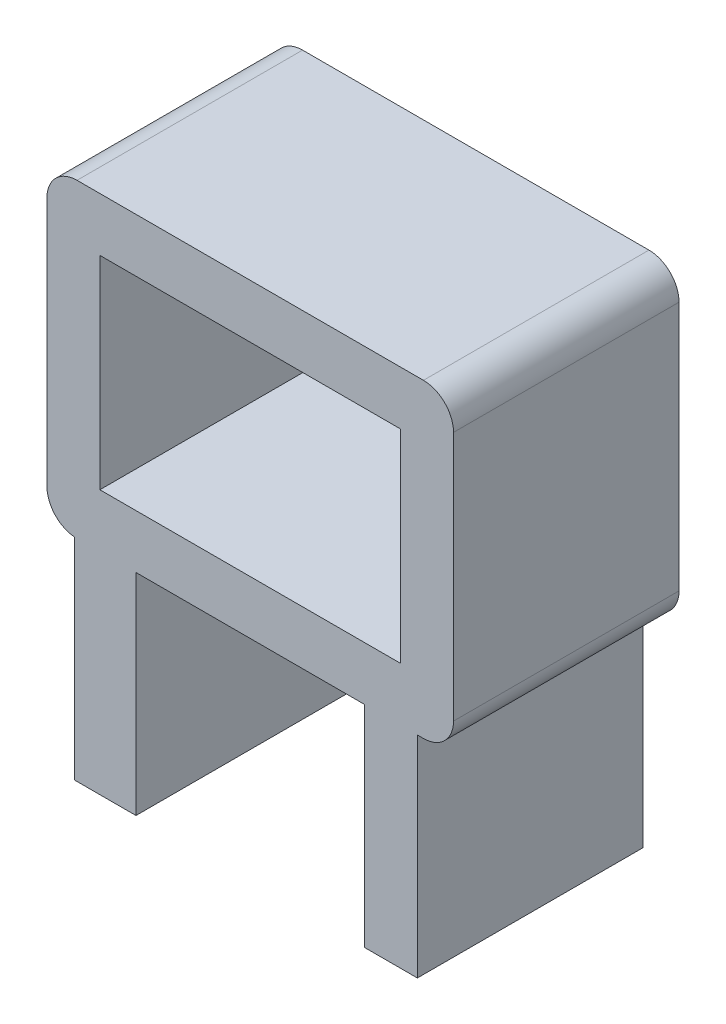
ISO-10303-21;
HEADER;
FILE_DESCRIPTION(('STEP AP214'),'2;1');
FILE_NAME('part.step','',(''),(''),'','','');
FILE_SCHEMA(('AUTOMOTIVE_DESIGN { 1 0 10303 214 1 1 1 1 }'));
ENDSEC;
DATA;
#1=APPLICATION_CONTEXT('core data for automotive mechanical design processes');
#2=APPLICATION_PROTOCOL_DEFINITION('international standard','automotive_design',2000,#1);
#3=PRODUCT_CONTEXT('',#1,'mechanical');
#4=PRODUCT('Part','Part','',(#3));
#5=PRODUCT_RELATED_PRODUCT_CATEGORY('part','',(#4));
#6=PRODUCT_DEFINITION_FORMATION('','',#4);
#7=PRODUCT_DEFINITION_CONTEXT('part definition',#1,'design');
#8=PRODUCT_DEFINITION('design','',#6,#7);
#9=PRODUCT_DEFINITION_SHAPE('','',#8);
#10=(LENGTH_UNIT() NAMED_UNIT(*) SI_UNIT(.MILLI.,.METRE.));
#11=(NAMED_UNIT(*) PLANE_ANGLE_UNIT() SI_UNIT($,.RADIAN.));
#12=(NAMED_UNIT(*) SI_UNIT($,.STERADIAN.) SOLID_ANGLE_UNIT());
#13=UNCERTAINTY_MEASURE_WITH_UNIT(LENGTH_MEASURE(1.E-05),#10,'distance_accuracy_value','');
#14=(GEOMETRIC_REPRESENTATION_CONTEXT(3) GLOBAL_UNCERTAINTY_ASSIGNED_CONTEXT((#13)) GLOBAL_UNIT_ASSIGNED_CONTEXT((#10,
#11,#12)) REPRESENTATION_CONTEXT('',''));
#15=CARTESIAN_POINT('',(0.,0.,0.));
#16=DIRECTION('',(0.,0.,1.));
#17=DIRECTION('',(1.,0.,0.));
#18=AXIS2_PLACEMENT_3D('',#15,#16,#17);
#19=CARTESIAN_POINT('',(0.,0.,15.));
#20=DIRECTION('',(0.,0.,-1.));
#21=DIRECTION('',(-1.,0.,0.));
#22=AXIS2_PLACEMENT_3D('',#19,#20,#21);
#23=PLANE('',#22);
#24=DIRECTION('',(0.,-1.,0.));
#25=VECTOR('',#24,1.);
#26=CARTESIAN_POINT('',(-25.8251099907621,19.935146108673,15.));
#27=LINE('',#26,#25);
#28=CARTESIAN_POINT('',(-25.8251099907621,17.935146108673,15.));
#29=VERTEX_POINT('',#28);
#30=CARTESIAN_POINT('',(-25.8251099907621,1.29754795464989,15.));
#31=VERTEX_POINT('',#30);
#32=EDGE_CURVE('E214',#29,#31,#27,.T.);
#33=ORIENTED_EDGE('',*,*,#32,.T.);
#34=CARTESIAN_POINT('',(-23.8251099907621,1.2975479546499,15.));
#35=DIRECTION('',(0.,0.,-1.));
#36=DIRECTION('',(-1.,0.,0.));
#37=AXIS2_PLACEMENT_3D('',#34,#35,#36);
#38=CIRCLE('',#37,2.);
#39=CARTESIAN_POINT('',(-24.0068353676499,-0.694178905990135,15.));
#40=VERTEX_POINT('',#39);
#41=EDGE_CURVE('E297',#31,#40,#38,.F.);
#42=ORIENTED_EDGE('',*,*,#41,.T.);
#43=DIRECTION('',(0.,-1.,0.));
#44=VECTOR('',#43,1.);
#45=CARTESIAN_POINT('',(-24.0068353676499,-14.6941789059901,15.));
#46=LINE('',#45,#44);
#47=CARTESIAN_POINT('',(-24.0068353676499,-14.6941789059901,15.));
#48=VERTEX_POINT('',#47);
#49=EDGE_CURVE('E217',#40,#48,#46,.T.);
#50=ORIENTED_EDGE('',*,*,#49,.T.);
#51=DIRECTION('',(1.,0.,0.));
#52=VECTOR('',#51,1.);
#53=CARTESIAN_POINT('',(-19.9047171963891,-14.6941789059901,15.));
#54=LINE('',#53,#52);
#55=CARTESIAN_POINT('',(-19.9047171963891,-14.6941789059901,15.));
#56=VERTEX_POINT('',#55);
#57=EDGE_CURVE('E219',#48,#56,#54,.T.);
#58=ORIENTED_EDGE('',*,*,#57,.T.);
#59=DIRECTION('',(0.,1.,0.));
#60=VECTOR('',#59,1.);
#61=CARTESIAN_POINT('',(-19.9047171963891,-0.694178905990134,15.));
#62=LINE('',#61,#60);
#63=CARTESIAN_POINT('',(-19.9047171963891,-0.694178905990134,15.));
#64=VERTEX_POINT('',#63);
#65=EDGE_CURVE('E221',#56,#64,#62,.T.);
#66=ORIENTED_EDGE('',*,*,#65,.T.);
#67=DIRECTION('',(1.,0.,0.));
#68=VECTOR('',#67,1.);
#69=CARTESIAN_POINT('',(-19.9047171963891,-0.694178905990134,15.));
#70=LINE('',#69,#68);
#71=CARTESIAN_POINT('',(-4.70471719638909,-0.694178905990131,15.));
#72=VERTEX_POINT('',#71);
#73=EDGE_CURVE('E223',#64,#72,#70,.T.);
#74=ORIENTED_EDGE('',*,*,#73,.T.);
#75=DIRECTION('',(0.,-1.,0.));
#76=VECTOR('',#75,1.);
#77=CARTESIAN_POINT('',(-4.70471719638909,-0.694178905990131,15.));
#78=LINE('',#77,#76);
#79=CARTESIAN_POINT('',(-4.70471719638909,-14.6941789059901,15.));
#80=VERTEX_POINT('',#79);
#81=EDGE_CURVE('E225',#72,#80,#78,.T.);
#82=ORIENTED_EDGE('',*,*,#81,.T.);
#83=DIRECTION('',(1.,0.,0.));
#84=VECTOR('',#83,1.);
#85=CARTESIAN_POINT('',(-4.70471719638909,-14.6941789059901,15.));
#86=LINE('',#85,#84);
#87=CARTESIAN_POINT('',(-1.18813915846709,-14.6941789059901,15.));
#88=VERTEX_POINT('',#87);
#89=EDGE_CURVE('E227',#80,#88,#86,.T.);
#90=ORIENTED_EDGE('',*,*,#89,.T.);
#91=DIRECTION('',(0.,1.,0.));
#92=VECTOR('',#91,1.);
#93=CARTESIAN_POINT('',(-1.18813915846709,-14.6941789059901,15.));
#94=LINE('',#93,#92);
#95=CARTESIAN_POINT('',(-1.18813915846709,-0.694178905990132,15.));
#96=VERTEX_POINT('',#95);
#97=EDGE_CURVE('E229',#88,#96,#94,.T.);
#98=ORIENTED_EDGE('',*,*,#97,.T.);
#99=DIRECTION('',(1.,0.,0.));
#100=VECTOR('',#99,1.);
#101=CARTESIAN_POINT('',(-1.18813915846709,-0.694178905990132,15.));
#102=LINE('',#101,#100);
#103=CARTESIAN_POINT('',(-0.784324402016098,-0.694178905990132,15.));
#104=VERTEX_POINT('',#103);
#105=EDGE_CURVE('E206',#96,#104,#102,.T.);
#106=ORIENTED_EDGE('',*,*,#105,.T.);
#107=CARTESIAN_POINT('',(-0.784324402016099,1.30582109400987,15.));
#108=DIRECTION('',(0.,0.,-1.));
#109=DIRECTION('',(-1.,0.,0.));
#110=AXIS2_PLACEMENT_3D('',#107,#108,#109);
#111=CIRCLE('',#110,2.);
#112=CARTESIAN_POINT('',(1.2156755979839,1.30582109400987,15.));
#113=VERTEX_POINT('',#112);
#114=EDGE_CURVE('E295',#104,#113,#111,.F.);
#115=ORIENTED_EDGE('',*,*,#114,.T.);
#116=DIRECTION('',(0.,1.,0.));
#117=VECTOR('',#116,1.);
#118=CARTESIAN_POINT('',(1.2156755979839,19.935146108673,15.));
#119=LINE('',#118,#117);
#120=CARTESIAN_POINT('',(1.2156755979839,17.935146108673,15.));
#121=VERTEX_POINT('',#120);
#122=EDGE_CURVE('E209',#113,#121,#119,.T.);
#123=ORIENTED_EDGE('',*,*,#122,.T.);
#124=CARTESIAN_POINT('',(-0.7843244020161,17.935146108673,15.));
#125=DIRECTION('',(0.,0.,-1.));
#126=DIRECTION('',(-1.,0.,0.));
#127=AXIS2_PLACEMENT_3D('',#124,#125,#126);
#128=CIRCLE('',#127,2.);
#129=CARTESIAN_POINT('',(-0.7843244020161,19.935146108673,15.));
#130=VERTEX_POINT('',#129);
#131=EDGE_CURVE('E53',#121,#130,#128,.F.);
#132=ORIENTED_EDGE('',*,*,#131,.T.);
#133=DIRECTION('',(-1.,0.,0.));
#134=VECTOR('',#133,1.);
#135=CARTESIAN_POINT('',(-25.8251099907621,19.935146108673,15.));
#136=LINE('',#135,#134);
#137=CARTESIAN_POINT('',(-23.8251099907621,19.935146108673,15.));
#138=VERTEX_POINT('',#137);
#139=EDGE_CURVE('E212',#130,#138,#136,.T.);
#140=ORIENTED_EDGE('',*,*,#139,.T.);
#141=CARTESIAN_POINT('',(-23.8251099907621,17.935146108673,15.));
#142=DIRECTION('',(0.,0.,-1.));
#143=DIRECTION('',(-1.,0.,0.));
#144=AXIS2_PLACEMENT_3D('',#141,#142,#143);
#145=CIRCLE('',#144,2.);
#146=EDGE_CURVE('E293',#138,#29,#145,.F.);
#147=ORIENTED_EDGE('',*,*,#146,.T.);
#148=EDGE_LOOP('',(#33,#42,#50,#58,#66,#74,#82,#90,#98,#106,#115,#123,#132,#140,#147));
#149=FACE_BOUND('',#148,.T.);
#150=DIRECTION('',(0.,1.,0.));
#151=VECTOR('',#150,1.);
#152=CARTESIAN_POINT('',(-2.30471719638909,16.3704836013414,15.));
#153=LINE('',#152,#151);
#154=CARTESIAN_POINT('',(-2.30471719638909,2.87048360134142,15.));
#155=VERTEX_POINT('',#154);
#156=CARTESIAN_POINT('',(-2.30471719638909,16.3704836013414,15.));
#157=VERTEX_POINT('',#156);
#158=EDGE_CURVE('E165',#155,#157,#153,.T.);
#159=ORIENTED_EDGE('',*,*,#158,.F.);
#160=DIRECTION('',(1.,0.,0.));
#161=VECTOR('',#160,1.);
#162=CARTESIAN_POINT('',(-22.3047171963891,2.87048360134142,15.));
#163=LINE('',#162,#161);
#164=CARTESIAN_POINT('',(-22.3047171963891,2.87048360134142,15.));
#165=VERTEX_POINT('',#164);
#166=EDGE_CURVE('E190',#165,#155,#163,.T.);
#167=ORIENTED_EDGE('',*,*,#166,.F.);
#168=DIRECTION('',(0.,-1.,0.));
#169=VECTOR('',#168,1.);
#170=CARTESIAN_POINT('',(-22.3047171963891,16.3704836013414,15.));
#171=LINE('',#170,#169);
#172=CARTESIAN_POINT('',(-22.3047171963891,16.3704836013414,15.));
#173=VERTEX_POINT('',#172);
#174=EDGE_CURVE('E188',#173,#165,#171,.T.);
#175=ORIENTED_EDGE('',*,*,#174,.F.);
#176=DIRECTION('',(-1.,0.,0.));
#177=VECTOR('',#176,1.);
#178=CARTESIAN_POINT('',(-22.3047171963891,16.3704836013414,15.));
#179=LINE('',#178,#177);
#180=EDGE_CURVE('E175',#157,#173,#179,.T.);
#181=ORIENTED_EDGE('',*,*,#180,.F.);
#182=EDGE_LOOP('',(#159,#167,#175,#181));
#183=FACE_BOUND('',#182,.T.);
#184=ADVANCED_FACE('F33',(#149,#183),#23,.F.);
#185=CARTESIAN_POINT('',(0.,0.,0.));
#186=DIRECTION('',(0.,0.,-1.));
#187=DIRECTION('',(-1.,0.,0.));
#188=AXIS2_PLACEMENT_3D('',#185,#186,#187);
#189=PLANE('',#188);
#190=DIRECTION('',(0.,-1.,0.));
#191=VECTOR('',#190,1.);
#192=CARTESIAN_POINT('',(-24.0068353676499,-14.6941789059901,0.));
#193=LINE('',#192,#191);
#194=CARTESIAN_POINT('',(-24.0068353676499,-0.694178905990135,0.));
#195=VERTEX_POINT('',#194);
#196=CARTESIAN_POINT('',(-24.0068353676499,-14.6941789059901,0.));
#197=VERTEX_POINT('',#196);
#198=EDGE_CURVE('E242',#195,#197,#193,.T.);
#199=ORIENTED_EDGE('',*,*,#198,.F.);
#200=CARTESIAN_POINT('',(-23.8251099907621,1.2975479546499,0.));
#201=DIRECTION('',(0.,0.,-1.));
#202=DIRECTION('',(-1.,0.,0.));
#203=AXIS2_PLACEMENT_3D('',#200,#201,#202);
#204=CIRCLE('',#203,2.);
#205=CARTESIAN_POINT('',(-25.8251099907621,1.29754795464989,0.));
#206=VERTEX_POINT('',#205);
#207=EDGE_CURVE('E285',#195,#206,#204,.T.);
#208=ORIENTED_EDGE('',*,*,#207,.T.);
#209=DIRECTION('',(0.,-1.,0.));
#210=VECTOR('',#209,1.);
#211=CARTESIAN_POINT('',(-25.8251099907621,19.935146108673,0.));
#212=LINE('',#211,#210);
#213=CARTESIAN_POINT('',(-25.8251099907621,17.935146108673,0.));
#214=VERTEX_POINT('',#213);
#215=EDGE_CURVE('E239',#214,#206,#212,.T.);
#216=ORIENTED_EDGE('',*,*,#215,.F.);
#217=CARTESIAN_POINT('',(-23.8251099907621,17.935146108673,0.));
#218=DIRECTION('',(0.,0.,-1.));
#219=DIRECTION('',(-1.,0.,0.));
#220=AXIS2_PLACEMENT_3D('',#217,#218,#219);
#221=CIRCLE('',#220,2.);
#222=CARTESIAN_POINT('',(-23.8251099907621,19.935146108673,0.));
#223=VERTEX_POINT('',#222);
#224=EDGE_CURVE('E281',#214,#223,#221,.T.);
#225=ORIENTED_EDGE('',*,*,#224,.T.);
#226=DIRECTION('',(-1.,0.,0.));
#227=VECTOR('',#226,1.);
#228=CARTESIAN_POINT('',(-25.8251099907621,19.935146108673,0.));
#229=LINE('',#228,#227);
#230=CARTESIAN_POINT('',(-0.7843244020161,19.935146108673,0.));
#231=VERTEX_POINT('',#230);
#232=EDGE_CURVE('E237',#231,#223,#229,.T.);
#233=ORIENTED_EDGE('',*,*,#232,.F.);
#234=CARTESIAN_POINT('',(-0.7843244020161,17.935146108673,0.));
#235=DIRECTION('',(0.,0.,-1.));
#236=DIRECTION('',(-1.,0.,0.));
#237=AXIS2_PLACEMENT_3D('',#234,#235,#236);
#238=CIRCLE('',#237,2.);
#239=CARTESIAN_POINT('',(1.2156755979839,17.935146108673,0.));
#240=VERTEX_POINT('',#239);
#241=EDGE_CURVE('E279',#231,#240,#238,.T.);
#242=ORIENTED_EDGE('',*,*,#241,.T.);
#243=DIRECTION('',(0.,1.,0.));
#244=VECTOR('',#243,1.);
#245=CARTESIAN_POINT('',(1.2156755979839,19.935146108673,0.));
#246=LINE('',#245,#244);
#247=CARTESIAN_POINT('',(1.2156755979839,1.30582109400987,0.));
#248=VERTEX_POINT('',#247);
#249=EDGE_CURVE('E234',#248,#240,#246,.T.);
#250=ORIENTED_EDGE('',*,*,#249,.F.);
#251=CARTESIAN_POINT('',(-0.784324402016099,1.30582109400987,0.));
#252=DIRECTION('',(0.,0.,-1.));
#253=DIRECTION('',(-1.,0.,0.));
#254=AXIS2_PLACEMENT_3D('',#251,#252,#253);
#255=CIRCLE('',#254,2.);
#256=CARTESIAN_POINT('',(-0.784324402016098,-0.694178905990132,0.));
#257=VERTEX_POINT('',#256);
#258=EDGE_CURVE('E283',#248,#257,#255,.T.);
#259=ORIENTED_EDGE('',*,*,#258,.T.);
#260=DIRECTION('',(1.,0.,0.));
#261=VECTOR('',#260,1.);
#262=CARTESIAN_POINT('',(-1.18813915846709,-0.694178905990132,0.));
#263=LINE('',#262,#261);
#264=CARTESIAN_POINT('',(-1.18813915846709,-0.694178905990132,0.));
#265=VERTEX_POINT('',#264);
#266=EDGE_CURVE('E183',#265,#257,#263,.T.);
#267=ORIENTED_EDGE('',*,*,#266,.F.);
#268=DIRECTION('',(0.,1.,0.));
#269=VECTOR('',#268,1.);
#270=CARTESIAN_POINT('',(-1.18813915846709,-14.6941789059901,0.));
#271=LINE('',#270,#269);
#272=CARTESIAN_POINT('',(-1.18813915846709,-14.6941789059901,0.));
#273=VERTEX_POINT('',#272);
#274=EDGE_CURVE('E210',#273,#265,#271,.T.);
#275=ORIENTED_EDGE('',*,*,#274,.F.);
#276=DIRECTION('',(1.,0.,0.));
#277=VECTOR('',#276,1.);
#278=CARTESIAN_POINT('',(-1.54283391819533,-14.6941789059901,0.));
#279=LINE('',#278,#277);
#280=CARTESIAN_POINT('',(-4.70471719638909,-14.6941789059901,0.));
#281=VERTEX_POINT('',#280);
#282=EDGE_CURVE('E253',#281,#273,#279,.T.);
#283=ORIENTED_EDGE('',*,*,#282,.F.);
#284=DIRECTION('',(0.,-1.,0.));
#285=VECTOR('',#284,1.);
#286=CARTESIAN_POINT('',(-4.70471719638909,-0.694178905990131,0.));
#287=LINE('',#286,#285);
#288=CARTESIAN_POINT('',(-4.70471719638909,-0.694178905990131,0.));
#289=VERTEX_POINT('',#288);
#290=EDGE_CURVE('E250',#289,#281,#287,.T.);
#291=ORIENTED_EDGE('',*,*,#290,.F.);
#292=DIRECTION('',(1.,0.,0.));
#293=VECTOR('',#292,1.);
#294=CARTESIAN_POINT('',(-19.9047171963891,-0.694178905990134,0.));
#295=LINE('',#294,#293);
#296=CARTESIAN_POINT('',(-19.9047171963891,-0.694178905990134,0.));
#297=VERTEX_POINT('',#296);
#298=EDGE_CURVE('E248',#297,#289,#295,.T.);
#299=ORIENTED_EDGE('',*,*,#298,.F.);
#300=DIRECTION('',(0.,1.,0.));
#301=VECTOR('',#300,1.);
#302=CARTESIAN_POINT('',(-19.9047171963891,-0.694178905990134,0.));
#303=LINE('',#302,#301);
#304=CARTESIAN_POINT('',(-19.9047171963891,-14.6941789059901,0.));
#305=VERTEX_POINT('',#304);
#306=EDGE_CURVE('E246',#305,#297,#303,.T.);
#307=ORIENTED_EDGE('',*,*,#306,.F.);
#308=DIRECTION('',(1.,0.,0.));
#309=VECTOR('',#308,1.);
#310=CARTESIAN_POINT('',(-19.9047171963891,-14.6941789059901,0.));
#311=LINE('',#310,#309);
#312=EDGE_CURVE('E244',#197,#305,#311,.T.);
#313=ORIENTED_EDGE('',*,*,#312,.F.);
#314=EDGE_LOOP('',(#199,#208,#216,#225,#233,#242,#250,#259,#267,#275,#283,#291,#299,#307,#313));
#315=FACE_BOUND('',#314,.T.);
#316=DIRECTION('',(1.,0.,0.));
#317=VECTOR('',#316,1.);
#318=CARTESIAN_POINT('',(-22.3047171963891,2.87048360134142,0.));
#319=LINE('',#318,#317);
#320=CARTESIAN_POINT('',(-22.3047171963891,2.87048360134142,0.));
#321=VERTEX_POINT('',#320);
#322=CARTESIAN_POINT('',(-2.30471719638909,2.87048360134142,0.));
#323=VERTEX_POINT('',#322);
#324=EDGE_CURVE('E176',#321,#323,#319,.T.);
#325=ORIENTED_EDGE('',*,*,#324,.T.);
#326=DIRECTION('',(0.,1.,0.));
#327=VECTOR('',#326,1.);
#328=CARTESIAN_POINT('',(-2.30471719638909,16.3704836013414,0.));
#329=LINE('',#328,#327);
#330=CARTESIAN_POINT('',(-2.30471719638909,16.3704836013414,0.));
#331=VERTEX_POINT('',#330);
#332=EDGE_CURVE('E194',#323,#331,#329,.T.);
#333=ORIENTED_EDGE('',*,*,#332,.T.);
#334=DIRECTION('',(-1.,0.,0.));
#335=VECTOR('',#334,1.);
#336=CARTESIAN_POINT('',(-22.3047171963891,16.3704836013414,0.));
#337=LINE('',#336,#335);
#338=CARTESIAN_POINT('',(-22.3047171963891,16.3704836013414,0.));
#339=VERTEX_POINT('',#338);
#340=EDGE_CURVE('E182',#331,#339,#337,.T.);
#341=ORIENTED_EDGE('',*,*,#340,.T.);
#342=DIRECTION('',(0.,-1.,0.));
#343=VECTOR('',#342,1.);
#344=CARTESIAN_POINT('',(-22.3047171963891,16.3704836013414,0.));
#345=LINE('',#344,#343);
#346=EDGE_CURVE('E197',#339,#321,#345,.T.);
#347=ORIENTED_EDGE('',*,*,#346,.T.);
#348=EDGE_LOOP('',(#325,#333,#341,#347));
#349=FACE_BOUND('',#348,.T.);
#350=ADVANCED_FACE('F312',(#315,#349),#189,.T.);
#351=CARTESIAN_POINT('',(-1.18813915846709,-0.694178905990132,15.));
#352=DIRECTION('',(0.,1.,0.));
#353=DIRECTION('',(-1.,0.,0.));
#354=AXIS2_PLACEMENT_3D('',#351,#352,#353);
#355=PLANE('',#354);
#356=ORIENTED_EDGE('',*,*,#266,.T.);
#357=DIRECTION('',(0.,0.,-1.));
#358=VECTOR('',#357,1.);
#359=CARTESIAN_POINT('',(-0.784324402016098,-0.694178905990132,15.));
#360=LINE('',#359,#358);
#361=EDGE_CURVE('E304',#257,#104,#360,.F.);
#362=ORIENTED_EDGE('',*,*,#361,.T.);
#363=ORIENTED_EDGE('',*,*,#105,.F.);
#364=DIRECTION('',(0.,0.,-1.));
#365=VECTOR('',#364,1.);
#366=CARTESIAN_POINT('',(-1.18813915846709,-0.694178905990132,15.));
#367=LINE('',#366,#365);
#368=EDGE_CURVE('E231',#96,#265,#367,.T.);
#369=ORIENTED_EDGE('',*,*,#368,.T.);
#370=EDGE_LOOP('',(#356,#362,#363,#369));
#371=FACE_BOUND('',#370,.T.);
#372=ADVANCED_FACE('F365',(#371),#355,.F.);
#373=CARTESIAN_POINT('',(1.2156755979839,19.935146108673,15.));
#374=DIRECTION('',(-1.,0.,0.));
#375=DIRECTION('',(0.,0.,1.));
#376=AXIS2_PLACEMENT_3D('',#373,#374,#375);
#377=PLANE('',#376);
#378=ORIENTED_EDGE('',*,*,#122,.F.);
#379=DIRECTION('',(0.,0.,-1.));
#380=VECTOR('',#379,1.);
#381=CARTESIAN_POINT('',(1.2156755979839,1.30582109400987,15.));
#382=LINE('',#381,#380);
#383=EDGE_CURVE('E301',#113,#248,#382,.T.);
#384=ORIENTED_EDGE('',*,*,#383,.T.);
#385=ORIENTED_EDGE('',*,*,#249,.T.);
#386=DIRECTION('',(0.,0.,-1.));
#387=VECTOR('',#386,1.);
#388=CARTESIAN_POINT('',(1.2156755979839,17.935146108673,15.));
#389=LINE('',#388,#387);
#390=EDGE_CURVE('E299',#240,#121,#389,.F.);
#391=ORIENTED_EDGE('',*,*,#390,.T.);
#392=EDGE_LOOP('',(#378,#384,#385,#391));
#393=FACE_BOUND('',#392,.T.);
#394=ADVANCED_FACE('F372',(#393),#377,.F.);
#395=CARTESIAN_POINT('',(-25.8251099907621,19.935146108673,15.));
#396=DIRECTION('',(0.,-1.,0.));
#397=DIRECTION('',(1.,0.,0.));
#398=AXIS2_PLACEMENT_3D('',#395,#396,#397);
#399=PLANE('',#398);
#400=ORIENTED_EDGE('',*,*,#232,.T.);
#401=DIRECTION('',(0.,0.,-1.));
#402=VECTOR('',#401,1.);
#403=CARTESIAN_POINT('',(-23.8251099907621,19.935146108673,15.));
#404=LINE('',#403,#402);
#405=EDGE_CURVE('E11',#223,#138,#404,.F.);
#406=ORIENTED_EDGE('',*,*,#405,.T.);
#407=ORIENTED_EDGE('',*,*,#139,.F.);
#408=DIRECTION('',(0.,0.,-1.));
#409=VECTOR('',#408,1.);
#410=CARTESIAN_POINT('',(-0.7843244020161,19.935146108673,15.));
#411=LINE('',#410,#409);
#412=EDGE_CURVE('E41',#130,#231,#411,.T.);
#413=ORIENTED_EDGE('',*,*,#412,.T.);
#414=EDGE_LOOP('',(#400,#406,#407,#413));
#415=FACE_BOUND('',#414,.T.);
#416=ADVANCED_FACE('F308',(#415),#399,.F.);
#417=CARTESIAN_POINT('',(-25.8251099907621,19.935146108673,15.));
#418=DIRECTION('',(1.,0.,0.));
#419=DIRECTION('',(0.,1.,0.));
#420=AXIS2_PLACEMENT_3D('',#417,#418,#419);
#421=PLANE('',#420);
#422=ORIENTED_EDGE('',*,*,#215,.T.);
#423=DIRECTION('',(0.,0.,-1.));
#424=VECTOR('',#423,1.);
#425=CARTESIAN_POINT('',(-25.8251099907621,1.29754795464989,15.));
#426=LINE('',#425,#424);
#427=EDGE_CURVE('E290',#206,#31,#426,.F.);
#428=ORIENTED_EDGE('',*,*,#427,.T.);
#429=ORIENTED_EDGE('',*,*,#32,.F.);
#430=DIRECTION('',(0.,0.,-1.));
#431=VECTOR('',#430,1.);
#432=CARTESIAN_POINT('',(-25.8251099907621,17.935146108673,15.));
#433=LINE('',#432,#431);
#434=EDGE_CURVE('E287',#29,#214,#433,.T.);
#435=ORIENTED_EDGE('',*,*,#434,.T.);
#436=EDGE_LOOP('',(#422,#428,#429,#435));
#437=FACE_BOUND('',#436,.T.);
#438=ADVANCED_FACE('F322',(#437),#421,.F.);
#439=CARTESIAN_POINT('',(-24.0068353676499,-14.6941789059901,15.));
#440=DIRECTION('',(1.,0.,0.));
#441=DIRECTION('',(0.,0.,-1.));
#442=AXIS2_PLACEMENT_3D('',#439,#440,#441);
#443=PLANE('',#442);
#444=ORIENTED_EDGE('',*,*,#198,.T.);
#445=DIRECTION('',(0.,0.,-1.));
#446=VECTOR('',#445,1.);
#447=CARTESIAN_POINT('',(-24.0068353676499,-14.6941789059901,15.));
#448=LINE('',#447,#446);
#449=EDGE_CURVE('E273',#48,#197,#448,.T.);
#450=ORIENTED_EDGE('',*,*,#449,.F.);
#451=ORIENTED_EDGE('',*,*,#49,.F.);
#452=DIRECTION('',(0.,0.,-1.));
#453=VECTOR('',#452,1.);
#454=CARTESIAN_POINT('',(-24.0068353676499,-0.694178905990135,15.));
#455=LINE('',#454,#453);
#456=EDGE_CURVE('E276',#40,#195,#455,.T.);
#457=ORIENTED_EDGE('',*,*,#456,.T.);
#458=EDGE_LOOP('',(#444,#450,#451,#457));
#459=FACE_BOUND('',#458,.T.);
#460=ADVANCED_FACE('F330',(#459),#443,.F.);
#461=CARTESIAN_POINT('',(-19.9047171963891,-14.6941789059901,15.));
#462=DIRECTION('',(0.,1.,0.));
#463=DIRECTION('',(0.,0.,1.));
#464=AXIS2_PLACEMENT_3D('',#461,#462,#463);
#465=PLANE('',#464);
#466=ORIENTED_EDGE('',*,*,#312,.T.);
#467=DIRECTION('',(0.,0.,-1.));
#468=VECTOR('',#467,1.);
#469=CARTESIAN_POINT('',(-19.9047171963891,-14.6941789059901,15.));
#470=LINE('',#469,#468);
#471=EDGE_CURVE('E270',#56,#305,#470,.T.);
#472=ORIENTED_EDGE('',*,*,#471,.F.);
#473=ORIENTED_EDGE('',*,*,#57,.F.);
#474=ORIENTED_EDGE('',*,*,#449,.T.);
#475=EDGE_LOOP('',(#466,#472,#473,#474));
#476=FACE_BOUND('',#475,.T.);
#477=ADVANCED_FACE('F337',(#476),#465,.F.);
#478=CARTESIAN_POINT('',(-19.9047171963891,-0.694178905990134,15.));
#479=DIRECTION('',(-1.,0.,0.));
#480=DIRECTION('',(0.,0.,1.));
#481=AXIS2_PLACEMENT_3D('',#478,#479,#480);
#482=PLANE('',#481);
#483=ORIENTED_EDGE('',*,*,#306,.T.);
#484=DIRECTION('',(0.,0.,-1.));
#485=VECTOR('',#484,1.);
#486=CARTESIAN_POINT('',(-19.9047171963891,-0.694178905990134,15.));
#487=LINE('',#486,#485);
#488=EDGE_CURVE('E267',#64,#297,#487,.T.);
#489=ORIENTED_EDGE('',*,*,#488,.F.);
#490=ORIENTED_EDGE('',*,*,#65,.F.);
#491=ORIENTED_EDGE('',*,*,#471,.T.);
#492=EDGE_LOOP('',(#483,#489,#490,#491));
#493=FACE_BOUND('',#492,.T.);
#494=ADVANCED_FACE('F341',(#493),#482,.F.);
#495=CARTESIAN_POINT('',(-19.9047171963891,-0.694178905990134,15.));
#496=DIRECTION('',(0.,1.,0.));
#497=DIRECTION('',(-1.,0.,0.));
#498=AXIS2_PLACEMENT_3D('',#495,#496,#497);
#499=PLANE('',#498);
#500=ORIENTED_EDGE('',*,*,#298,.T.);
#501=DIRECTION('',(0.,0.,-1.));
#502=VECTOR('',#501,1.);
#503=CARTESIAN_POINT('',(-4.70471719638909,-0.694178905990131,15.));
#504=LINE('',#503,#502);
#505=EDGE_CURVE('E264',#72,#289,#504,.T.);
#506=ORIENTED_EDGE('',*,*,#505,.F.);
#507=ORIENTED_EDGE('',*,*,#73,.F.);
#508=ORIENTED_EDGE('',*,*,#488,.T.);
#509=EDGE_LOOP('',(#500,#506,#507,#508));
#510=FACE_BOUND('',#509,.T.);
#511=ADVANCED_FACE('F348',(#510),#499,.F.);
#512=CARTESIAN_POINT('',(-4.70471719638909,-0.694178905990131,15.));
#513=DIRECTION('',(1.,0.,0.));
#514=DIRECTION('',(0.,1.,0.));
#515=AXIS2_PLACEMENT_3D('',#512,#513,#514);
#516=PLANE('',#515);
#517=ORIENTED_EDGE('',*,*,#290,.T.);
#518=DIRECTION('',(0.,0.,-1.));
#519=VECTOR('',#518,1.);
#520=CARTESIAN_POINT('',(-4.70471719638909,-14.6941789059901,15.));
#521=LINE('',#520,#519);
#522=EDGE_CURVE('E261',#80,#281,#521,.T.);
#523=ORIENTED_EDGE('',*,*,#522,.F.);
#524=ORIENTED_EDGE('',*,*,#81,.F.);
#525=ORIENTED_EDGE('',*,*,#505,.T.);
#526=EDGE_LOOP('',(#517,#523,#524,#525));
#527=FACE_BOUND('',#526,.T.);
#528=ADVANCED_FACE('F351',(#527),#516,.F.);
#529=CARTESIAN_POINT('',(-1.54283391819533,-14.6941789059901,15.));
#530=DIRECTION('',(0.,1.,0.));
#531=DIRECTION('',(0.,0.,1.));
#532=AXIS2_PLACEMENT_3D('',#529,#530,#531);
#533=PLANE('',#532);
#534=ORIENTED_EDGE('',*,*,#282,.T.);
#535=DIRECTION('',(0.,0.,-1.));
#536=VECTOR('',#535,1.);
#537=CARTESIAN_POINT('',(-1.18813915846709,-14.6941789059901,15.));
#538=LINE('',#537,#536);
#539=EDGE_CURVE('E258',#88,#273,#538,.T.);
#540=ORIENTED_EDGE('',*,*,#539,.F.);
#541=ORIENTED_EDGE('',*,*,#89,.F.);
#542=ORIENTED_EDGE('',*,*,#522,.T.);
#543=EDGE_LOOP('',(#534,#540,#541,#542));
#544=FACE_BOUND('',#543,.T.);
#545=ADVANCED_FACE('F355',(#544),#533,.F.);
#546=CARTESIAN_POINT('',(-1.18813915846709,-14.6941789059901,15.));
#547=DIRECTION('',(-1.,0.,0.));
#548=DIRECTION('',(0.,-1.,0.));
#549=AXIS2_PLACEMENT_3D('',#546,#547,#548);
#550=PLANE('',#549);
#551=ORIENTED_EDGE('',*,*,#274,.T.);
#552=ORIENTED_EDGE('',*,*,#368,.F.);
#553=ORIENTED_EDGE('',*,*,#97,.F.);
#554=ORIENTED_EDGE('',*,*,#539,.T.);
#555=EDGE_LOOP('',(#551,#552,#553,#554));
#556=FACE_BOUND('',#555,.T.);
#557=ADVANCED_FACE('F361',(#556),#550,.F.);
#558=CARTESIAN_POINT('',(-2.30471719638909,16.3704836013414,15.));
#559=DIRECTION('',(-1.,0.,0.));
#560=DIRECTION('',(0.,-1.,0.));
#561=AXIS2_PLACEMENT_3D('',#558,#559,#560);
#562=PLANE('',#561);
#563=ORIENTED_EDGE('',*,*,#332,.F.);
#564=DIRECTION('',(0.,0.,-1.));
#565=VECTOR('',#564,1.);
#566=CARTESIAN_POINT('',(-2.30471719638909,2.87048360134142,15.));
#567=LINE('',#566,#565);
#568=EDGE_CURVE('E171',#155,#323,#567,.T.);
#569=ORIENTED_EDGE('',*,*,#568,.F.);
#570=ORIENTED_EDGE('',*,*,#158,.T.);
#571=DIRECTION('',(0.,0.,-1.));
#572=VECTOR('',#571,1.);
#573=CARTESIAN_POINT('',(-2.30471719638909,16.3704836013414,15.));
#574=LINE('',#573,#572);
#575=EDGE_CURVE('E168',#157,#331,#574,.T.);
#576=ORIENTED_EDGE('',*,*,#575,.T.);
#577=EDGE_LOOP('',(#563,#569,#570,#576));
#578=FACE_BOUND('',#577,.T.);
#579=ADVANCED_FACE('F167',(#578),#562,.T.);
#580=CARTESIAN_POINT('',(-22.3047171963891,16.3704836013414,15.));
#581=DIRECTION('',(0.,-1.,0.));
#582=DIRECTION('',(0.,0.,-1.));
#583=AXIS2_PLACEMENT_3D('',#580,#581,#582);
#584=PLANE('',#583);
#585=ORIENTED_EDGE('',*,*,#340,.F.);
#586=ORIENTED_EDGE('',*,*,#575,.F.);
#587=ORIENTED_EDGE('',*,*,#180,.T.);
#588=DIRECTION('',(0.,0.,-1.));
#589=VECTOR('',#588,1.);
#590=CARTESIAN_POINT('',(-22.3047171963891,16.3704836013414,15.));
#591=LINE('',#590,#589);
#592=EDGE_CURVE('E184',#173,#339,#591,.T.);
#593=ORIENTED_EDGE('',*,*,#592,.T.);
#594=EDGE_LOOP('',(#585,#586,#587,#593));
#595=FACE_BOUND('',#594,.T.);
#596=ADVANCED_FACE('F179',(#595),#584,.T.);
#597=CARTESIAN_POINT('',(-22.3047171963891,16.3704836013414,15.));
#598=DIRECTION('',(1.,0.,0.));
#599=DIRECTION('',(0.,0.,-1.));
#600=AXIS2_PLACEMENT_3D('',#597,#598,#599);
#601=PLANE('',#600);
#602=ORIENTED_EDGE('',*,*,#346,.F.);
#603=ORIENTED_EDGE('',*,*,#592,.F.);
#604=ORIENTED_EDGE('',*,*,#174,.T.);
#605=DIRECTION('',(0.,0.,-1.));
#606=VECTOR('',#605,1.);
#607=CARTESIAN_POINT('',(-22.3047171963891,2.87048360134142,15.));
#608=LINE('',#607,#606);
#609=EDGE_CURVE('E203',#165,#321,#608,.T.);
#610=ORIENTED_EDGE('',*,*,#609,.T.);
#611=EDGE_LOOP('',(#602,#603,#604,#610));
#612=FACE_BOUND('',#611,.T.);
#613=ADVANCED_FACE('F442',(#612),#601,.T.);
#614=CARTESIAN_POINT('',(-22.3047171963891,2.87048360134142,15.));
#615=DIRECTION('',(0.,1.,0.));
#616=DIRECTION('',(0.,0.,1.));
#617=AXIS2_PLACEMENT_3D('',#614,#615,#616);
#618=PLANE('',#617);
#619=ORIENTED_EDGE('',*,*,#324,.F.);
#620=ORIENTED_EDGE('',*,*,#609,.F.);
#621=ORIENTED_EDGE('',*,*,#166,.T.);
#622=ORIENTED_EDGE('',*,*,#568,.T.);
#623=EDGE_LOOP('',(#619,#620,#621,#622));
#624=FACE_BOUND('',#623,.T.);
#625=ADVANCED_FACE('F411',(#624),#618,.T.);
#626=CARTESIAN_POINT('',(-23.8251099907621,1.2975479546499,15.));
#627=DIRECTION('',(0.,0.,-1.));
#628=DIRECTION('',(-1.,0.,0.));
#629=AXIS2_PLACEMENT_3D('',#626,#627,#628);
#630=CYLINDRICAL_SURFACE('',#629,2.);
#631=ORIENTED_EDGE('',*,*,#41,.F.);
#632=ORIENTED_EDGE('',*,*,#427,.F.);
#633=ORIENTED_EDGE('',*,*,#207,.F.);
#634=ORIENTED_EDGE('',*,*,#456,.F.);
#635=EDGE_LOOP('',(#631,#632,#633,#634));
#636=FACE_BOUND('',#635,.T.);
#637=ADVANCED_FACE('F328',(#636),#630,.T.);
#638=CARTESIAN_POINT('',(-0.784324402016099,1.30582109400987,15.));
#639=DIRECTION('',(0.,0.,-1.));
#640=DIRECTION('',(-1.,0.,0.));
#641=AXIS2_PLACEMENT_3D('',#638,#639,#640);
#642=CYLINDRICAL_SURFACE('',#641,2.);
#643=ORIENTED_EDGE('',*,*,#114,.F.);
#644=ORIENTED_EDGE('',*,*,#361,.F.);
#645=ORIENTED_EDGE('',*,*,#258,.F.);
#646=ORIENTED_EDGE('',*,*,#383,.F.);
#647=EDGE_LOOP('',(#643,#644,#645,#646));
#648=FACE_BOUND('',#647,.T.);
#649=ADVANCED_FACE('F368',(#648),#642,.T.);
#650=CARTESIAN_POINT('',(-23.8251099907621,17.935146108673,15.));
#651=DIRECTION('',(0.,0.,-1.));
#652=DIRECTION('',(-1.,0.,0.));
#653=AXIS2_PLACEMENT_3D('',#650,#651,#652);
#654=CYLINDRICAL_SURFACE('',#653,2.);
#655=ORIENTED_EDGE('',*,*,#146,.F.);
#656=ORIENTED_EDGE('',*,*,#405,.F.);
#657=ORIENTED_EDGE('',*,*,#224,.F.);
#658=ORIENTED_EDGE('',*,*,#434,.F.);
#659=EDGE_LOOP('',(#655,#656,#657,#658));
#660=FACE_BOUND('',#659,.T.);
#661=ADVANCED_FACE('F319',(#660),#654,.T.);
#662=CARTESIAN_POINT('',(-0.7843244020161,17.935146108673,15.));
#663=DIRECTION('',(0.,0.,-1.));
#664=DIRECTION('',(-1.,0.,0.));
#665=AXIS2_PLACEMENT_3D('',#662,#663,#664);
#666=CYLINDRICAL_SURFACE('',#665,2.);
#667=ORIENTED_EDGE('',*,*,#131,.F.);
#668=ORIENTED_EDGE('',*,*,#390,.F.);
#669=ORIENTED_EDGE('',*,*,#241,.F.);
#670=ORIENTED_EDGE('',*,*,#412,.F.);
#671=EDGE_LOOP('',(#667,#668,#669,#670));
#672=FACE_BOUND('',#671,.T.);
#673=ADVANCED_FACE('F35',(#672),#666,.T.);
#674=CLOSED_SHELL('',(#184,#350,#372,#394,#416,#438,#460,#477,#494,#511,#528,#545,#557,#579,
#596,#613,#625,#637,#649,#661,#673));
#675=MANIFOLD_SOLID_BREP('B2',#674);
#676=ADVANCED_BREP_SHAPE_REPRESENTATION('',(#18,#675),#14);
#677=SHAPE_DEFINITION_REPRESENTATION(#9,#676);
ENDSEC;
END-ISO-10303-21;
